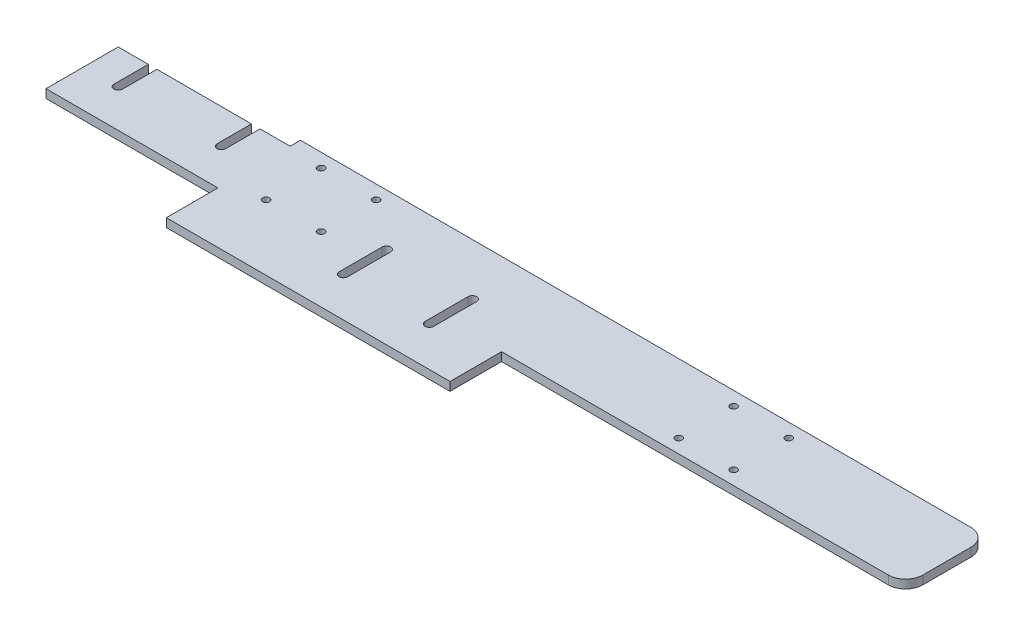
ISO-10303-21;
HEADER;
FILE_DESCRIPTION(('STEP AP214'),'2;1');
FILE_NAME('part.step','',(''),(''),'','','');
FILE_SCHEMA(('AUTOMOTIVE_DESIGN { 1 0 10303 214 1 1 1 1 }'));
ENDSEC;
DATA;
#1=APPLICATION_CONTEXT('core data for automotive mechanical design processes');
#2=APPLICATION_PROTOCOL_DEFINITION('international standard','automotive_design',2000,#1);
#3=PRODUCT_CONTEXT('',#1,'mechanical');
#4=PRODUCT('Part','Part','',(#3));
#5=PRODUCT_RELATED_PRODUCT_CATEGORY('part','',(#4));
#6=PRODUCT_DEFINITION_FORMATION('','',#4);
#7=PRODUCT_DEFINITION_CONTEXT('part definition',#1,'design');
#8=PRODUCT_DEFINITION('design','',#6,#7);
#9=PRODUCT_DEFINITION_SHAPE('','',#8);
#10=(LENGTH_UNIT() NAMED_UNIT(*) SI_UNIT(.MILLI.,.METRE.));
#11=(NAMED_UNIT(*) PLANE_ANGLE_UNIT() SI_UNIT($,.RADIAN.));
#12=(NAMED_UNIT(*) SI_UNIT($,.STERADIAN.) SOLID_ANGLE_UNIT());
#13=UNCERTAINTY_MEASURE_WITH_UNIT(LENGTH_MEASURE(1.E-05),#10,'distance_accuracy_value','');
#14=(GEOMETRIC_REPRESENTATION_CONTEXT(3) GLOBAL_UNCERTAINTY_ASSIGNED_CONTEXT((#13)) GLOBAL_UNIT_ASSIGNED_CONTEXT((#10,
#11,#12)) REPRESENTATION_CONTEXT('',''));
#15=CARTESIAN_POINT('',(0.,0.,0.));
#16=DIRECTION('',(0.,0.,1.));
#17=DIRECTION('',(1.,0.,0.));
#18=AXIS2_PLACEMENT_3D('',#15,#16,#17);
#19=CARTESIAN_POINT('',(-100.,0.,6.00000000000001));
#20=DIRECTION('',(0.,0.,1.));
#21=DIRECTION('',(1.,0.,0.));
#22=AXIS2_PLACEMENT_3D('',#19,#20,#21);
#23=PLANE('',#22);
#24=DIRECTION('',(1.,0.,0.));
#25=VECTOR('',#24,1.);
#26=CARTESIAN_POINT('',(-100.,0.,6.00000000000001));
#27=LINE('',#26,#25);
#28=CARTESIAN_POINT('',(-77.5,0.,6.00000000000001));
#29=VERTEX_POINT('',#28);
#30=CARTESIAN_POINT('',(-22.5,0.,6.));
#31=VERTEX_POINT('',#30);
#32=EDGE_CURVE('E461',#29,#31,#27,.T.);
#33=ORIENTED_EDGE('',*,*,#32,.F.);
#34=DIRECTION('',(0.,1.,0.));
#35=VECTOR('',#34,1.);
#36=CARTESIAN_POINT('',(-77.5,0.,6.00000000000001));
#37=LINE('',#36,#35);
#38=CARTESIAN_POINT('',(-77.5,5.,6.00000000000001));
#39=VERTEX_POINT('',#38);
#40=EDGE_CURVE('E270',#29,#39,#37,.T.);
#41=ORIENTED_EDGE('',*,*,#40,.T.);
#42=DIRECTION('',(1.,0.,0.));
#43=VECTOR('',#42,1.);
#44=CARTESIAN_POINT('',(-100.,5.,6.00000000000001));
#45=LINE('',#44,#43);
#46=CARTESIAN_POINT('',(-22.5,5.,6.00000000000001));
#47=VERTEX_POINT('',#46);
#48=EDGE_CURVE('E467',#39,#47,#45,.T.);
#49=ORIENTED_EDGE('',*,*,#48,.T.);
#50=DIRECTION('',(0.,1.,0.));
#51=VECTOR('',#50,1.);
#52=CARTESIAN_POINT('',(-22.5,0.,6.00000000000001));
#53=LINE('',#52,#51);
#54=EDGE_CURVE('E292',#31,#47,#53,.T.);
#55=ORIENTED_EDGE('',*,*,#54,.F.);
#56=EDGE_LOOP('',(#33,#41,#49,#55));
#57=FACE_BOUND('',#56,.T.);
#58=ADVANCED_FACE('F38',(#57),#23,.F.);
#59=CARTESIAN_POINT('',(-17.5,0.,6.00000000000001));
#60=VERTEX_POINT('',#59);
#61=CARTESIAN_POINT('',(0.,0.,6.));
#62=VERTEX_POINT('',#61);
#63=EDGE_CURVE('E454',#60,#62,#27,.T.);
#64=ORIENTED_EDGE('',*,*,#63,.F.);
#65=DIRECTION('',(0.,1.,0.));
#66=VECTOR('',#65,1.);
#67=CARTESIAN_POINT('',(-17.5,0.,6.00000000000001));
#68=LINE('',#67,#66);
#69=CARTESIAN_POINT('',(-17.5,5.,6.00000000000001));
#70=VERTEX_POINT('',#69);
#71=EDGE_CURVE('E267',#60,#70,#68,.T.);
#72=ORIENTED_EDGE('',*,*,#71,.T.);
#73=CARTESIAN_POINT('',(0.,5.,6.));
#74=VERTEX_POINT('',#73);
#75=EDGE_CURVE('E460',#70,#74,#45,.T.);
#76=ORIENTED_EDGE('',*,*,#75,.T.);
#77=DIRECTION('',(0.,-1.,0.));
#78=VECTOR('',#77,1.);
#79=CARTESIAN_POINT('',(0.,0.,6.));
#80=LINE('',#79,#78);
#81=EDGE_CURVE('E438',#74,#62,#80,.T.);
#82=ORIENTED_EDGE('',*,*,#81,.T.);
#83=EDGE_LOOP('',(#64,#72,#76,#82));
#84=FACE_BOUND('',#83,.T.);
#85=ADVANCED_FACE('F612',(#84),#23,.F.);
#86=CARTESIAN_POINT('',(0.,5.,48.));
#87=DIRECTION('',(0.,0.,-1.));
#88=DIRECTION('',(-1.,0.,0.));
#89=AXIS2_PLACEMENT_3D('',#86,#87,#88);
#90=PLANE('',#89);
#91=DIRECTION('',(0.,-1.,0.));
#92=VECTOR('',#91,1.);
#93=CARTESIAN_POINT('',(0.,0.,48.));
#94=LINE('',#93,#92);
#95=CARTESIAN_POINT('',(0.,5.,48.));
#96=VERTEX_POINT('',#95);
#97=CARTESIAN_POINT('',(0.,0.,48.));
#98=VERTEX_POINT('',#97);
#99=EDGE_CURVE('E407',#96,#98,#94,.T.);
#100=ORIENTED_EDGE('',*,*,#99,.F.);
#101=DIRECTION('',(1.,0.,0.));
#102=VECTOR('',#101,1.);
#103=CARTESIAN_POINT('',(0.,5.,48.));
#104=LINE('',#103,#102);
#105=CARTESIAN_POINT('',(-100.,5.,48.));
#106=VERTEX_POINT('',#105);
#107=EDGE_CURVE('E541',#106,#96,#104,.T.);
#108=ORIENTED_EDGE('',*,*,#107,.F.);
#109=DIRECTION('',(0.,1.,0.));
#110=VECTOR('',#109,1.);
#111=CARTESIAN_POINT('',(-100.,5.,48.));
#112=LINE('',#111,#110);
#113=CARTESIAN_POINT('',(-100.,0.,48.));
#114=VERTEX_POINT('',#113);
#115=EDGE_CURVE('E450',#114,#106,#112,.T.);
#116=ORIENTED_EDGE('',*,*,#115,.F.);
#117=DIRECTION('',(1.,0.,0.));
#118=VECTOR('',#117,1.);
#119=CARTESIAN_POINT('',(0.,0.,48.));
#120=LINE('',#119,#118);
#121=EDGE_CURVE('E556',#114,#98,#120,.T.);
#122=ORIENTED_EDGE('',*,*,#121,.T.);
#123=EDGE_LOOP('',(#100,#108,#116,#122));
#124=FACE_BOUND('',#123,.T.);
#125=ADVANCED_FACE('F632',(#124),#90,.F.);
#126=CARTESIAN_POINT('',(165.,0.,48.));
#127=VERTEX_POINT('',#126);
#128=CARTESIAN_POINT('',(390.,0.,48.));
#129=VERTEX_POINT('',#128);
#130=EDGE_CURVE('E555',#127,#129,#120,.T.);
#131=ORIENTED_EDGE('',*,*,#130,.T.);
#132=DIRECTION('',(0.,-1.,0.));
#133=VECTOR('',#132,1.);
#134=CARTESIAN_POINT('',(390.,5.,48.));
#135=LINE('',#134,#133);
#136=CARTESIAN_POINT('',(390.,5.,48.));
#137=VERTEX_POINT('',#136);
#138=EDGE_CURVE('E62',#129,#137,#135,.F.);
#139=ORIENTED_EDGE('',*,*,#138,.T.);
#140=CARTESIAN_POINT('',(165.,5.,48.));
#141=VERTEX_POINT('',#140);
#142=EDGE_CURVE('E540',#141,#137,#104,.T.);
#143=ORIENTED_EDGE('',*,*,#142,.F.);
#144=DIRECTION('',(0.,1.,0.));
#145=VECTOR('',#144,1.);
#146=CARTESIAN_POINT('',(165.,5.,48.));
#147=LINE('',#146,#145);
#148=EDGE_CURVE('E274',#127,#141,#147,.T.);
#149=ORIENTED_EDGE('',*,*,#148,.F.);
#150=EDGE_LOOP('',(#131,#139,#143,#149));
#151=FACE_BOUND('',#150,.T.);
#152=ADVANCED_FACE('F594',(#151),#90,.F.);
#153=CARTESIAN_POINT('',(0.,5.,0.));
#154=DIRECTION('',(1.,0.,0.));
#155=DIRECTION('',(0.,0.,-1.));
#156=AXIS2_PLACEMENT_3D('',#153,#154,#155);
#157=PLANE('',#156);
#158=ORIENTED_EDGE('',*,*,#81,.F.);
#159=DIRECTION('',(0.,0.,1.));
#160=VECTOR('',#159,1.);
#161=CARTESIAN_POINT('',(0.,5.,0.));
#162=LINE('',#161,#160);
#163=CARTESIAN_POINT('',(0.,5.,0.));
#164=VERTEX_POINT('',#163);
#165=EDGE_CURVE('E535',#164,#74,#162,.T.);
#166=ORIENTED_EDGE('',*,*,#165,.F.);
#167=DIRECTION('',(0.,-1.,0.));
#168=VECTOR('',#167,1.);
#169=CARTESIAN_POINT('',(0.,5.,0.));
#170=LINE('',#169,#168);
#171=CARTESIAN_POINT('',(0.,0.,0.));
#172=VERTEX_POINT('',#171);
#173=EDGE_CURVE('E548',#164,#172,#170,.T.);
#174=ORIENTED_EDGE('',*,*,#173,.T.);
#175=DIRECTION('',(0.,0.,1.));
#176=VECTOR('',#175,1.);
#177=CARTESIAN_POINT('',(0.,0.,0.));
#178=LINE('',#177,#176);
#179=EDGE_CURVE('E551',#172,#62,#178,.T.);
#180=ORIENTED_EDGE('',*,*,#179,.T.);
#181=EDGE_LOOP('',(#158,#166,#174,#180));
#182=FACE_BOUND('',#181,.T.);
#183=ADVANCED_FACE('F609',(#182),#157,.F.);
#184=CARTESIAN_POINT('',(0.,5.,0.));
#185=DIRECTION('',(0.,1.,0.));
#186=DIRECTION('',(0.,0.,1.));
#187=AXIS2_PLACEMENT_3D('',#184,#185,#186);
#188=PLANE('',#187);
#189=ORIENTED_EDGE('',*,*,#142,.T.);
#190=CARTESIAN_POINT('',(390.,5.,38.));
#191=DIRECTION('',(0.,1.,0.));
#192=DIRECTION('',(0.,0.,1.));
#193=AXIS2_PLACEMENT_3D('',#190,#191,#192);
#194=CIRCLE('',#193,10.);
#195=CARTESIAN_POINT('',(400.,5.,38.));
#196=VERTEX_POINT('',#195);
#197=EDGE_CURVE('E47',#137,#196,#194,.T.);
#198=ORIENTED_EDGE('',*,*,#197,.T.);
#199=DIRECTION('',(0.,0.,-1.));
#200=VECTOR('',#199,1.);
#201=CARTESIAN_POINT('',(400.,5.,48.));
#202=LINE('',#201,#200);
#203=CARTESIAN_POINT('',(400.,5.,9.99999999999997));
#204=VERTEX_POINT('',#203);
#205=EDGE_CURVE('E545',#196,#204,#202,.T.);
#206=ORIENTED_EDGE('',*,*,#205,.T.);
#207=CARTESIAN_POINT('',(390.,5.,9.99999999999997));
#208=DIRECTION('',(0.,1.,0.));
#209=DIRECTION('',(0.,0.,1.));
#210=AXIS2_PLACEMENT_3D('',#207,#208,#209);
#211=CIRCLE('',#210,10.);
#212=CARTESIAN_POINT('',(390.,5.,0.));
#213=VERTEX_POINT('',#212);
#214=EDGE_CURVE('E54',#204,#213,#211,.T.);
#215=ORIENTED_EDGE('',*,*,#214,.T.);
#216=DIRECTION('',(-1.,0.,0.));
#217=VECTOR('',#216,1.);
#218=CARTESIAN_POINT('',(400.,5.,0.));
#219=LINE('',#218,#217);
#220=EDGE_CURVE('E532',#213,#164,#219,.T.);
#221=ORIENTED_EDGE('',*,*,#220,.T.);
#222=ORIENTED_EDGE('',*,*,#165,.T.);
#223=ORIENTED_EDGE('',*,*,#75,.F.);
#224=DIRECTION('',(0.,0.,-1.));
#225=VECTOR('',#224,1.);
#226=CARTESIAN_POINT('',(-17.5,5.,6.00000000000001));
#227=LINE('',#226,#225);
#228=CARTESIAN_POINT('',(-17.5,5.,26.));
#229=VERTEX_POINT('',#228);
#230=EDGE_CURVE('E284',#229,#70,#227,.T.);
#231=ORIENTED_EDGE('',*,*,#230,.F.);
#232=CARTESIAN_POINT('',(-20.,5.,26.));
#233=DIRECTION('',(0.,1.,0.));
#234=DIRECTION('',(0.,0.,1.));
#235=AXIS2_PLACEMENT_3D('',#232,#233,#234);
#236=CIRCLE('',#235,2.5);
#237=CARTESIAN_POINT('',(-22.5,5.,26.));
#238=VERTEX_POINT('',#237);
#239=EDGE_CURVE('E297',#238,#229,#236,.T.);
#240=ORIENTED_EDGE('',*,*,#239,.F.);
#241=DIRECTION('',(0.,0.,1.));
#242=VECTOR('',#241,1.);
#243=CARTESIAN_POINT('',(-22.5,5.,6.00000000000001));
#244=LINE('',#243,#242);
#245=EDGE_CURVE('E293',#47,#238,#244,.T.);
#246=ORIENTED_EDGE('',*,*,#245,.F.);
#247=ORIENTED_EDGE('',*,*,#48,.F.);
#248=DIRECTION('',(0.,0.,-1.));
#249=VECTOR('',#248,1.);
#250=CARTESIAN_POINT('',(-77.5,5.,6.00000000000001));
#251=LINE('',#250,#249);
#252=CARTESIAN_POINT('',(-77.5,5.,26.));
#253=VERTEX_POINT('',#252);
#254=EDGE_CURVE('E257',#253,#39,#251,.T.);
#255=ORIENTED_EDGE('',*,*,#254,.F.);
#256=CARTESIAN_POINT('',(-80.,5.,26.));
#257=DIRECTION('',(0.,1.,0.));
#258=DIRECTION('',(0.,0.,1.));
#259=AXIS2_PLACEMENT_3D('',#256,#257,#258);
#260=CIRCLE('',#259,2.5);
#261=CARTESIAN_POINT('',(-82.5,5.,26.));
#262=VERTEX_POINT('',#261);
#263=EDGE_CURVE('E260',#262,#253,#260,.T.);
#264=ORIENTED_EDGE('',*,*,#263,.F.);
#265=DIRECTION('',(0.,0.,1.));
#266=VECTOR('',#265,1.);
#267=CARTESIAN_POINT('',(-82.5,5.,6.00000000000001));
#268=LINE('',#267,#266);
#269=CARTESIAN_POINT('',(-82.5,5.,6.00000000000001));
#270=VERTEX_POINT('',#269);
#271=EDGE_CURVE('E232',#270,#262,#268,.T.);
#272=ORIENTED_EDGE('',*,*,#271,.F.);
#273=CARTESIAN_POINT('',(-100.,5.,6.00000000000001));
#274=VERTEX_POINT('',#273);
#275=EDGE_CURVE('E462',#274,#270,#45,.T.);
#276=ORIENTED_EDGE('',*,*,#275,.F.);
#277=DIRECTION('',(0.,0.,-1.));
#278=VECTOR('',#277,1.);
#279=CARTESIAN_POINT('',(-100.,5.,6.00000000000001));
#280=LINE('',#279,#278);
#281=EDGE_CURVE('E439',#106,#274,#280,.T.);
#282=ORIENTED_EDGE('',*,*,#281,.F.);
#283=ORIENTED_EDGE('',*,*,#107,.T.);
#284=DIRECTION('',(0.,0.,-1.));
#285=VECTOR('',#284,1.);
#286=CARTESIAN_POINT('',(0.,5.,78.));
#287=LINE('',#286,#285);
#288=CARTESIAN_POINT('',(0.,5.,78.));
#289=VERTEX_POINT('',#288);
#290=EDGE_CURVE('E426',#289,#96,#287,.T.);
#291=ORIENTED_EDGE('',*,*,#290,.F.);
#292=DIRECTION('',(-1.,0.,0.));
#293=VECTOR('',#292,1.);
#294=CARTESIAN_POINT('',(0.,5.,78.));
#295=LINE('',#294,#293);
#296=CARTESIAN_POINT('',(165.,5.,78.));
#297=VERTEX_POINT('',#296);
#298=EDGE_CURVE('E410',#297,#289,#295,.T.);
#299=ORIENTED_EDGE('',*,*,#298,.F.);
#300=DIRECTION('',(0.,0.,-1.));
#301=VECTOR('',#300,1.);
#302=CARTESIAN_POINT('',(165.,5.,78.));
#303=LINE('',#302,#301);
#304=EDGE_CURVE('E430',#297,#141,#303,.T.);
#305=ORIENTED_EDGE('',*,*,#304,.T.);
#306=EDGE_LOOP('',(#189,#198,#206,#215,#221,#222,#223,#231,#240,#246,#247,#255,#264,#272,#276,
#282,#283,#291,#299,#305));
#307=FACE_BOUND('',#306,.T.);
#308=CARTESIAN_POINT('',(80.,5.,30.));
#309=DIRECTION('',(0.,1.,0.));
#310=DIRECTION('',(0.,0.,1.));
#311=AXIS2_PLACEMENT_3D('',#308,#309,#310);
#312=CIRCLE('',#311,2.50000000000003);
#313=CARTESIAN_POINT('',(82.5,5.,30.));
#314=VERTEX_POINT('',#313);
#315=CARTESIAN_POINT('',(77.5,5.,30.));
#316=VERTEX_POINT('',#315);
#317=EDGE_CURVE('E333',#314,#316,#312,.T.);
#318=ORIENTED_EDGE('',*,*,#317,.F.);
#319=DIRECTION('',(0.,0.,-1.));
#320=VECTOR('',#319,1.);
#321=CARTESIAN_POINT('',(82.5,5.,30.));
#322=LINE('',#321,#320);
#323=CARTESIAN_POINT('',(82.5,5.,55.));
#324=VERTEX_POINT('',#323);
#325=EDGE_CURVE('E320',#324,#314,#322,.T.);
#326=ORIENTED_EDGE('',*,*,#325,.F.);
#327=CARTESIAN_POINT('',(80.,5.,55.));
#328=DIRECTION('',(0.,1.,0.));
#329=DIRECTION('',(0.,0.,1.));
#330=AXIS2_PLACEMENT_3D('',#327,#328,#329);
#331=CIRCLE('',#330,2.50000000000002);
#332=CARTESIAN_POINT('',(77.5,5.,55.));
#333=VERTEX_POINT('',#332);
#334=EDGE_CURVE('E341',#333,#324,#331,.T.);
#335=ORIENTED_EDGE('',*,*,#334,.F.);
#336=DIRECTION('',(0.,0.,1.));
#337=VECTOR('',#336,1.);
#338=CARTESIAN_POINT('',(77.5,5.,30.));
#339=LINE('',#338,#337);
#340=EDGE_CURVE('E336',#316,#333,#339,.T.);
#341=ORIENTED_EDGE('',*,*,#340,.F.);
#342=EDGE_LOOP('',(#318,#326,#335,#341));
#343=FACE_BOUND('',#342,.T.);
#344=CARTESIAN_POINT('',(130.,5.,30.));
#345=DIRECTION('',(0.,1.,0.));
#346=DIRECTION('',(0.,0.,1.));
#347=AXIS2_PLACEMENT_3D('',#344,#345,#346);
#348=CIRCLE('',#347,2.5);
#349=CARTESIAN_POINT('',(132.5,5.,30.));
#350=VERTEX_POINT('',#349);
#351=CARTESIAN_POINT('',(127.5,5.,30.));
#352=VERTEX_POINT('',#351);
#353=EDGE_CURVE('E377',#350,#352,#348,.T.);
#354=ORIENTED_EDGE('',*,*,#353,.F.);
#355=DIRECTION('',(0.,0.,-1.));
#356=VECTOR('',#355,1.);
#357=CARTESIAN_POINT('',(132.5,5.,30.));
#358=LINE('',#357,#356);
#359=CARTESIAN_POINT('',(132.5,5.,55.));
#360=VERTEX_POINT('',#359);
#361=EDGE_CURVE('E364',#360,#350,#358,.T.);
#362=ORIENTED_EDGE('',*,*,#361,.F.);
#363=CARTESIAN_POINT('',(130.,5.,55.));
#364=DIRECTION('',(0.,1.,0.));
#365=DIRECTION('',(0.,0.,1.));
#366=AXIS2_PLACEMENT_3D('',#363,#364,#365);
#367=CIRCLE('',#366,2.5);
#368=CARTESIAN_POINT('',(127.5,5.,55.));
#369=VERTEX_POINT('',#368);
#370=EDGE_CURVE('E384',#369,#360,#367,.T.);
#371=ORIENTED_EDGE('',*,*,#370,.F.);
#372=DIRECTION('',(0.,0.,1.));
#373=VECTOR('',#372,1.);
#374=CARTESIAN_POINT('',(127.5,5.,30.));
#375=LINE('',#374,#373);
#376=EDGE_CURVE('E380',#352,#369,#375,.T.);
#377=ORIENTED_EDGE('',*,*,#376,.F.);
#378=EDGE_LOOP('',(#354,#362,#371,#377));
#379=FACE_BOUND('',#378,.T.);
#380=CARTESIAN_POINT('',(260.,5.,40.));
#381=DIRECTION('',(0.,1.,0.));
#382=DIRECTION('',(0.,0.,1.));
#383=AXIS2_PLACEMENT_3D('',#380,#381,#382);
#384=CIRCLE('',#383,2.);
#385=CARTESIAN_POINT('',(260.,5.,42.));
#386=VERTEX_POINT('',#385);
#387=EDGE_CURVE('E476',#386,#386,#384,.T.);
#388=ORIENTED_EDGE('',*,*,#387,.F.);
#389=EDGE_LOOP('',(#388));
#390=FACE_BOUND('',#389,.T.);
#391=CARTESIAN_POINT('',(52.,5.,40.));
#392=DIRECTION('',(0.,1.,0.));
#393=DIRECTION('',(0.,0.,1.));
#394=AXIS2_PLACEMENT_3D('',#391,#392,#393);
#395=CIRCLE('',#394,2.00000000000001);
#396=CARTESIAN_POINT('',(52.,5.,42.));
#397=VERTEX_POINT('',#396);
#398=EDGE_CURVE('E492',#397,#397,#395,.T.);
#399=ORIENTED_EDGE('',*,*,#398,.F.);
#400=EDGE_LOOP('',(#399));
#401=FACE_BOUND('',#400,.T.);
#402=CARTESIAN_POINT('',(292.,5.,8.));
#403=DIRECTION('',(0.,1.,0.));
#404=DIRECTION('',(0.,0.,1.));
#405=AXIS2_PLACEMENT_3D('',#402,#403,#404);
#406=CIRCLE('',#405,2.);
#407=CARTESIAN_POINT('',(292.,5.,9.99999999999999));
#408=VERTEX_POINT('',#407);
#409=EDGE_CURVE('E508',#408,#408,#406,.T.);
#410=ORIENTED_EDGE('',*,*,#409,.F.);
#411=EDGE_LOOP('',(#410));
#412=FACE_BOUND('',#411,.T.);
#413=CARTESIAN_POINT('',(20.,5.,8.));
#414=DIRECTION('',(0.,1.,0.));
#415=DIRECTION('',(0.,0.,1.));
#416=AXIS2_PLACEMENT_3D('',#413,#414,#415);
#417=CIRCLE('',#416,2.);
#418=CARTESIAN_POINT('',(20.,5.,10.));
#419=VERTEX_POINT('',#418);
#420=EDGE_CURVE('E524',#419,#419,#417,.T.);
#421=ORIENTED_EDGE('',*,*,#420,.F.);
#422=EDGE_LOOP('',(#421));
#423=FACE_BOUND('',#422,.T.);
#424=CARTESIAN_POINT('',(20.,5.,40.));
#425=DIRECTION('',(0.,1.,0.));
#426=DIRECTION('',(0.,0.,-1.));
#427=AXIS2_PLACEMENT_3D('',#424,#425,#426);
#428=CIRCLE('',#427,2.);
#429=CARTESIAN_POINT('',(20.,5.,38.));
#430=VERTEX_POINT('',#429);
#431=EDGE_CURVE('E516',#430,#430,#428,.T.);
#432=ORIENTED_EDGE('',*,*,#431,.F.);
#433=EDGE_LOOP('',(#432));
#434=FACE_BOUND('',#433,.T.);
#435=CARTESIAN_POINT('',(292.,5.,40.));
#436=DIRECTION('',(0.,1.,0.));
#437=DIRECTION('',(0.,0.,-1.));
#438=AXIS2_PLACEMENT_3D('',#435,#436,#437);
#439=CIRCLE('',#438,2.);
#440=CARTESIAN_POINT('',(292.,5.,38.));
#441=VERTEX_POINT('',#440);
#442=EDGE_CURVE('E500',#441,#441,#439,.T.);
#443=ORIENTED_EDGE('',*,*,#442,.F.);
#444=EDGE_LOOP('',(#443));
#445=FACE_BOUND('',#444,.T.);
#446=CARTESIAN_POINT('',(52.,5.,8.));
#447=DIRECTION('',(0.,1.,0.));
#448=DIRECTION('',(0.,0.,-1.));
#449=AXIS2_PLACEMENT_3D('',#446,#447,#448);
#450=CIRCLE('',#449,2.);
#451=CARTESIAN_POINT('',(52.,5.,6.));
#452=VERTEX_POINT('',#451);
#453=EDGE_CURVE('E484',#452,#452,#450,.T.);
#454=ORIENTED_EDGE('',*,*,#453,.F.);
#455=EDGE_LOOP('',(#454));
#456=FACE_BOUND('',#455,.T.);
#457=CARTESIAN_POINT('',(260.,5.,8.));
#458=DIRECTION('',(0.,1.,0.));
#459=DIRECTION('',(0.,0.,-1.));
#460=AXIS2_PLACEMENT_3D('',#457,#458,#459);
#461=CIRCLE('',#460,2.);
#462=CARTESIAN_POINT('',(260.,5.,6.));
#463=VERTEX_POINT('',#462);
#464=EDGE_CURVE('E468',#463,#463,#461,.T.);
#465=ORIENTED_EDGE('',*,*,#464,.F.);
#466=EDGE_LOOP('',(#465));
#467=FACE_BOUND('',#466,.T.);
#468=ADVANCED_FACE('F584',(#307,#343,#379,#390,#401,#412,#423,#434,#445,#456,#467),#188,.T.);
#469=CARTESIAN_POINT('',(0.,0.,0.));
#470=DIRECTION('',(0.,1.,0.));
#471=DIRECTION('',(0.,0.,1.));
#472=AXIS2_PLACEMENT_3D('',#469,#470,#471);
#473=PLANE('',#472);
#474=DIRECTION('',(0.,0.,-1.));
#475=VECTOR('',#474,1.);
#476=CARTESIAN_POINT('',(82.5,0.,30.));
#477=LINE('',#476,#475);
#478=CARTESIAN_POINT('',(82.5,0.,55.));
#479=VERTEX_POINT('',#478);
#480=CARTESIAN_POINT('',(82.5,0.,30.));
#481=VERTEX_POINT('',#480);
#482=EDGE_CURVE('E328',#479,#481,#477,.T.);
#483=ORIENTED_EDGE('',*,*,#482,.T.);
#484=CARTESIAN_POINT('',(80.,0.,30.));
#485=DIRECTION('',(0.,1.,0.));
#486=DIRECTION('',(0.,0.,1.));
#487=AXIS2_PLACEMENT_3D('',#484,#485,#486);
#488=CIRCLE('',#487,2.50000000000003);
#489=CARTESIAN_POINT('',(77.5,0.,30.));
#490=VERTEX_POINT('',#489);
#491=EDGE_CURVE('E315',#481,#490,#488,.T.);
#492=ORIENTED_EDGE('',*,*,#491,.T.);
#493=DIRECTION('',(0.,0.,1.));
#494=VECTOR('',#493,1.);
#495=CARTESIAN_POINT('',(77.5,0.,30.));
#496=LINE('',#495,#494);
#497=CARTESIAN_POINT('',(77.5,0.,55.));
#498=VERTEX_POINT('',#497);
#499=EDGE_CURVE('E319',#490,#498,#496,.T.);
#500=ORIENTED_EDGE('',*,*,#499,.T.);
#501=CARTESIAN_POINT('',(80.,0.,55.));
#502=DIRECTION('',(0.,1.,0.));
#503=DIRECTION('',(0.,0.,1.));
#504=AXIS2_PLACEMENT_3D('',#501,#502,#503);
#505=CIRCLE('',#504,2.50000000000002);
#506=EDGE_CURVE('E324',#498,#479,#505,.T.);
#507=ORIENTED_EDGE('',*,*,#506,.T.);
#508=EDGE_LOOP('',(#483,#492,#500,#507));
#509=FACE_BOUND('',#508,.T.);
#510=DIRECTION('',(0.,0.,-1.));
#511=VECTOR('',#510,1.);
#512=CARTESIAN_POINT('',(132.5,0.,30.));
#513=LINE('',#512,#511);
#514=CARTESIAN_POINT('',(132.5,0.,55.));
#515=VERTEX_POINT('',#514);
#516=CARTESIAN_POINT('',(132.5,0.,30.));
#517=VERTEX_POINT('',#516);
#518=EDGE_CURVE('E372',#515,#517,#513,.T.);
#519=ORIENTED_EDGE('',*,*,#518,.T.);
#520=CARTESIAN_POINT('',(130.,0.,30.));
#521=DIRECTION('',(0.,1.,0.));
#522=DIRECTION('',(0.,0.,1.));
#523=AXIS2_PLACEMENT_3D('',#520,#521,#522);
#524=CIRCLE('',#523,2.5);
#525=CARTESIAN_POINT('',(127.5,0.,30.));
#526=VERTEX_POINT('',#525);
#527=EDGE_CURVE('E359',#517,#526,#524,.T.);
#528=ORIENTED_EDGE('',*,*,#527,.T.);
#529=DIRECTION('',(0.,0.,1.));
#530=VECTOR('',#529,1.);
#531=CARTESIAN_POINT('',(127.5,0.,30.));
#532=LINE('',#531,#530);
#533=CARTESIAN_POINT('',(127.5,0.,55.));
#534=VERTEX_POINT('',#533);
#535=EDGE_CURVE('E363',#526,#534,#532,.T.);
#536=ORIENTED_EDGE('',*,*,#535,.T.);
#537=CARTESIAN_POINT('',(130.,0.,55.));
#538=DIRECTION('',(0.,1.,0.));
#539=DIRECTION('',(0.,0.,1.));
#540=AXIS2_PLACEMENT_3D('',#537,#538,#539);
#541=CIRCLE('',#540,2.5);
#542=EDGE_CURVE('E368',#534,#515,#541,.T.);
#543=ORIENTED_EDGE('',*,*,#542,.T.);
#544=EDGE_LOOP('',(#519,#528,#536,#543));
#545=FACE_BOUND('',#544,.T.);
#546=DIRECTION('',(0.,0.,-1.));
#547=VECTOR('',#546,1.);
#548=CARTESIAN_POINT('',(400.,0.,48.));
#549=LINE('',#548,#547);
#550=CARTESIAN_POINT('',(400.,0.,38.));
#551=VERTEX_POINT('',#550);
#552=CARTESIAN_POINT('',(400.,0.,9.99999999999997));
#553=VERTEX_POINT('',#552);
#554=EDGE_CURVE('E536',#551,#553,#549,.T.);
#555=ORIENTED_EDGE('',*,*,#554,.F.);
#556=CARTESIAN_POINT('',(390.,0.,38.));
#557=DIRECTION('',(0.,1.,0.));
#558=DIRECTION('',(0.,0.,1.));
#559=AXIS2_PLACEMENT_3D('',#556,#557,#558);
#560=CIRCLE('',#559,10.);
#561=EDGE_CURVE('E575',#551,#129,#560,.F.);
#562=ORIENTED_EDGE('',*,*,#561,.T.);
#563=ORIENTED_EDGE('',*,*,#130,.F.);
#564=DIRECTION('',(0.,0.,-1.));
#565=VECTOR('',#564,1.);
#566=CARTESIAN_POINT('',(165.,0.,78.));
#567=LINE('',#566,#565);
#568=CARTESIAN_POINT('',(165.,0.,78.));
#569=VERTEX_POINT('',#568);
#570=EDGE_CURVE('E434',#569,#127,#567,.T.);
#571=ORIENTED_EDGE('',*,*,#570,.F.);
#572=DIRECTION('',(1.,0.,0.));
#573=VECTOR('',#572,1.);
#574=CARTESIAN_POINT('',(165.,0.,78.));
#575=LINE('',#574,#573);
#576=CARTESIAN_POINT('',(0.,0.,78.));
#577=VERTEX_POINT('',#576);
#578=EDGE_CURVE('E402',#577,#569,#575,.T.);
#579=ORIENTED_EDGE('',*,*,#578,.F.);
#580=DIRECTION('',(0.,0.,-1.));
#581=VECTOR('',#580,1.);
#582=CARTESIAN_POINT('',(0.,0.,78.));
#583=LINE('',#582,#581);
#584=EDGE_CURVE('E416',#577,#98,#583,.T.);
#585=ORIENTED_EDGE('',*,*,#584,.T.);
#586=ORIENTED_EDGE('',*,*,#121,.F.);
#587=DIRECTION('',(0.,0.,1.));
#588=VECTOR('',#587,1.);
#589=CARTESIAN_POINT('',(-100.,0.,48.));
#590=LINE('',#589,#588);
#591=CARTESIAN_POINT('',(-100.,0.,6.00000000000001));
#592=VERTEX_POINT('',#591);
#593=EDGE_CURVE('E446',#592,#114,#590,.T.);
#594=ORIENTED_EDGE('',*,*,#593,.F.);
#595=CARTESIAN_POINT('',(-82.5,0.,6.00000000000001));
#596=VERTEX_POINT('',#595);
#597=EDGE_CURVE('E255',#592,#596,#27,.T.);
#598=ORIENTED_EDGE('',*,*,#597,.T.);
#599=DIRECTION('',(0.,0.,1.));
#600=VECTOR('',#599,1.);
#601=CARTESIAN_POINT('',(-82.5,0.,6.00000000000001));
#602=LINE('',#601,#600);
#603=CARTESIAN_POINT('',(-82.5,0.,26.));
#604=VERTEX_POINT('',#603);
#605=EDGE_CURVE('E229',#596,#604,#602,.T.);
#606=ORIENTED_EDGE('',*,*,#605,.T.);
#607=CARTESIAN_POINT('',(-80.,0.,26.));
#608=DIRECTION('',(0.,1.,0.));
#609=DIRECTION('',(0.,0.,1.));
#610=AXIS2_PLACEMENT_3D('',#607,#608,#609);
#611=CIRCLE('',#610,2.5);
#612=CARTESIAN_POINT('',(-77.5,0.,26.));
#613=VERTEX_POINT('',#612);
#614=EDGE_CURVE('E241',#604,#613,#611,.T.);
#615=ORIENTED_EDGE('',*,*,#614,.T.);
#616=DIRECTION('',(0.,0.,-1.));
#617=VECTOR('',#616,1.);
#618=CARTESIAN_POINT('',(-77.5,0.,6.00000000000001));
#619=LINE('',#618,#617);
#620=EDGE_CURVE('E247',#613,#29,#619,.T.);
#621=ORIENTED_EDGE('',*,*,#620,.T.);
#622=ORIENTED_EDGE('',*,*,#32,.T.);
#623=DIRECTION('',(0.,0.,1.));
#624=VECTOR('',#623,1.);
#625=CARTESIAN_POINT('',(-22.5,0.,6.00000000000001));
#626=LINE('',#625,#624);
#627=CARTESIAN_POINT('',(-22.5,0.,26.));
#628=VERTEX_POINT('',#627);
#629=EDGE_CURVE('E279',#31,#628,#626,.T.);
#630=ORIENTED_EDGE('',*,*,#629,.T.);
#631=CARTESIAN_POINT('',(-20.,0.,26.));
#632=DIRECTION('',(0.,1.,0.));
#633=DIRECTION('',(0.,0.,1.));
#634=AXIS2_PLACEMENT_3D('',#631,#632,#633);
#635=CIRCLE('',#634,2.5);
#636=CARTESIAN_POINT('',(-17.5,0.,26.));
#637=VERTEX_POINT('',#636);
#638=EDGE_CURVE('E283',#628,#637,#635,.T.);
#639=ORIENTED_EDGE('',*,*,#638,.T.);
#640=DIRECTION('',(0.,0.,-1.));
#641=VECTOR('',#640,1.);
#642=CARTESIAN_POINT('',(-17.5,0.,6.00000000000001));
#643=LINE('',#642,#641);
#644=EDGE_CURVE('E288',#637,#60,#643,.T.);
#645=ORIENTED_EDGE('',*,*,#644,.T.);
#646=ORIENTED_EDGE('',*,*,#63,.T.);
#647=ORIENTED_EDGE('',*,*,#179,.F.);
#648=DIRECTION('',(-1.,0.,0.));
#649=VECTOR('',#648,1.);
#650=CARTESIAN_POINT('',(400.,0.,0.));
#651=LINE('',#650,#649);
#652=CARTESIAN_POINT('',(390.,0.,0.));
#653=VERTEX_POINT('',#652);
#654=EDGE_CURVE('E528',#653,#172,#651,.T.);
#655=ORIENTED_EDGE('',*,*,#654,.F.);
#656=CARTESIAN_POINT('',(390.,0.,9.99999999999997));
#657=DIRECTION('',(0.,1.,0.));
#658=DIRECTION('',(0.,0.,1.));
#659=AXIS2_PLACEMENT_3D('',#656,#657,#658);
#660=CIRCLE('',#659,10.);
#661=EDGE_CURVE('E572',#653,#553,#660,.F.);
#662=ORIENTED_EDGE('',*,*,#661,.T.);
#663=EDGE_LOOP('',(#555,#562,#563,#571,#579,#585,#586,#594,#598,#606,#615,#621,#622,#630,#639,
#645,#646,#647,#655,#662));
#664=FACE_BOUND('',#663,.T.);
#665=CARTESIAN_POINT('',(20.,0.,8.));
#666=DIRECTION('',(0.,1.,0.));
#667=DIRECTION('',(0.,0.,1.));
#668=AXIS2_PLACEMENT_3D('',#665,#666,#667);
#669=CIRCLE('',#668,2.);
#670=CARTESIAN_POINT('',(20.,0.,10.));
#671=VERTEX_POINT('',#670);
#672=EDGE_CURVE('E520',#671,#671,#669,.T.);
#673=ORIENTED_EDGE('',*,*,#672,.T.);
#674=EDGE_LOOP('',(#673));
#675=FACE_BOUND('',#674,.T.);
#676=CARTESIAN_POINT('',(20.,0.,40.));
#677=DIRECTION('',(0.,1.,0.));
#678=DIRECTION('',(0.,0.,-1.));
#679=AXIS2_PLACEMENT_3D('',#676,#677,#678);
#680=CIRCLE('',#679,2.);
#681=CARTESIAN_POINT('',(20.,0.,38.));
#682=VERTEX_POINT('',#681);
#683=EDGE_CURVE('E512',#682,#682,#680,.T.);
#684=ORIENTED_EDGE('',*,*,#683,.T.);
#685=EDGE_LOOP('',(#684));
#686=FACE_BOUND('',#685,.T.);
#687=CARTESIAN_POINT('',(292.,0.,8.));
#688=DIRECTION('',(0.,1.,0.));
#689=DIRECTION('',(0.,0.,1.));
#690=AXIS2_PLACEMENT_3D('',#687,#688,#689);
#691=CIRCLE('',#690,2.);
#692=CARTESIAN_POINT('',(292.,0.,9.99999999999999));
#693=VERTEX_POINT('',#692);
#694=EDGE_CURVE('E504',#693,#693,#691,.T.);
#695=ORIENTED_EDGE('',*,*,#694,.T.);
#696=EDGE_LOOP('',(#695));
#697=FACE_BOUND('',#696,.T.);
#698=CARTESIAN_POINT('',(292.,0.,40.));
#699=DIRECTION('',(0.,1.,0.));
#700=DIRECTION('',(0.,0.,-1.));
#701=AXIS2_PLACEMENT_3D('',#698,#699,#700);
#702=CIRCLE('',#701,2.);
#703=CARTESIAN_POINT('',(292.,0.,38.));
#704=VERTEX_POINT('',#703);
#705=EDGE_CURVE('E496',#704,#704,#702,.T.);
#706=ORIENTED_EDGE('',*,*,#705,.T.);
#707=EDGE_LOOP('',(#706));
#708=FACE_BOUND('',#707,.T.);
#709=CARTESIAN_POINT('',(52.,0.,40.));
#710=DIRECTION('',(0.,1.,0.));
#711=DIRECTION('',(0.,0.,1.));
#712=AXIS2_PLACEMENT_3D('',#709,#710,#711);
#713=CIRCLE('',#712,2.00000000000001);
#714=CARTESIAN_POINT('',(52.,0.,42.));
#715=VERTEX_POINT('',#714);
#716=EDGE_CURVE('E488',#715,#715,#713,.T.);
#717=ORIENTED_EDGE('',*,*,#716,.T.);
#718=EDGE_LOOP('',(#717));
#719=FACE_BOUND('',#718,.T.);
#720=CARTESIAN_POINT('',(52.,0.,8.));
#721=DIRECTION('',(0.,1.,0.));
#722=DIRECTION('',(0.,0.,-1.));
#723=AXIS2_PLACEMENT_3D('',#720,#721,#722);
#724=CIRCLE('',#723,2.);
#725=CARTESIAN_POINT('',(52.,0.,6.));
#726=VERTEX_POINT('',#725);
#727=EDGE_CURVE('E480',#726,#726,#724,.T.);
#728=ORIENTED_EDGE('',*,*,#727,.T.);
#729=EDGE_LOOP('',(#728));
#730=FACE_BOUND('',#729,.T.);
#731=CARTESIAN_POINT('',(260.,0.,40.));
#732=DIRECTION('',(0.,1.,0.));
#733=DIRECTION('',(0.,0.,1.));
#734=AXIS2_PLACEMENT_3D('',#731,#732,#733);
#735=CIRCLE('',#734,2.);
#736=CARTESIAN_POINT('',(260.,0.,42.));
#737=VERTEX_POINT('',#736);
#738=EDGE_CURVE('E472',#737,#737,#735,.T.);
#739=ORIENTED_EDGE('',*,*,#738,.T.);
#740=EDGE_LOOP('',(#739));
#741=FACE_BOUND('',#740,.T.);
#742=CARTESIAN_POINT('',(260.,0.,8.));
#743=DIRECTION('',(0.,1.,0.));
#744=DIRECTION('',(0.,0.,-1.));
#745=AXIS2_PLACEMENT_3D('',#742,#743,#744);
#746=CIRCLE('',#745,2.);
#747=CARTESIAN_POINT('',(260.,0.,6.));
#748=VERTEX_POINT('',#747);
#749=EDGE_CURVE('E466',#748,#748,#746,.T.);
#750=ORIENTED_EDGE('',*,*,#749,.T.);
#751=EDGE_LOOP('',(#750));
#752=FACE_BOUND('',#751,.T.);
#753=ADVANCED_FACE('F251',(#509,#545,#664,#675,#686,#697,#708,#719,#730,#741,#752),#473,.F.);
#754=CARTESIAN_POINT('',(400.,5.,0.));
#755=DIRECTION('',(0.,0.,1.));
#756=DIRECTION('',(1.,0.,0.));
#757=AXIS2_PLACEMENT_3D('',#754,#755,#756);
#758=PLANE('',#757);
#759=ORIENTED_EDGE('',*,*,#220,.F.);
#760=DIRECTION('',(0.,-1.,0.));
#761=VECTOR('',#760,1.);
#762=CARTESIAN_POINT('',(390.,5.,0.));
#763=LINE('',#762,#761);
#764=EDGE_CURVE('E11',#213,#653,#763,.T.);
#765=ORIENTED_EDGE('',*,*,#764,.T.);
#766=ORIENTED_EDGE('',*,*,#654,.T.);
#767=ORIENTED_EDGE('',*,*,#173,.F.);
#768=EDGE_LOOP('',(#759,#765,#766,#767));
#769=FACE_BOUND('',#768,.T.);
#770=ADVANCED_FACE('F617',(#769),#758,.F.);
#771=CARTESIAN_POINT('',(400.,5.,48.));
#772=DIRECTION('',(-1.,0.,0.));
#773=DIRECTION('',(0.,0.,1.));
#774=AXIS2_PLACEMENT_3D('',#771,#772,#773);
#775=PLANE('',#774);
#776=ORIENTED_EDGE('',*,*,#205,.F.);
#777=DIRECTION('',(0.,-1.,0.));
#778=VECTOR('',#777,1.);
#779=CARTESIAN_POINT('',(400.,5.,38.));
#780=LINE('',#779,#778);
#781=EDGE_CURVE('E568',#196,#551,#780,.T.);
#782=ORIENTED_EDGE('',*,*,#781,.T.);
#783=ORIENTED_EDGE('',*,*,#554,.T.);
#784=DIRECTION('',(0.,-1.,0.));
#785=VECTOR('',#784,1.);
#786=CARTESIAN_POINT('',(400.,5.,9.99999999999997));
#787=LINE('',#786,#785);
#788=EDGE_CURVE('E565',#553,#204,#787,.F.);
#789=ORIENTED_EDGE('',*,*,#788,.T.);
#790=EDGE_LOOP('',(#776,#782,#783,#789));
#791=FACE_BOUND('',#790,.T.);
#792=ADVANCED_FACE('F589',(#791),#775,.F.);
#793=CARTESIAN_POINT('',(20.,5.,8.));
#794=DIRECTION('',(0.,-1.,0.));
#795=DIRECTION('',(0.,0.,-1.));
#796=AXIS2_PLACEMENT_3D('',#793,#794,#795);
#797=CYLINDRICAL_SURFACE('',#796,2.);
#798=ORIENTED_EDGE('',*,*,#420,.T.);
#799=EDGE_LOOP('',(#798));
#800=FACE_BOUND('',#799,.T.);
#801=ORIENTED_EDGE('',*,*,#672,.F.);
#802=EDGE_LOOP('',(#801));
#803=FACE_BOUND('',#802,.T.);
#804=ADVANCED_FACE('F741',(#800,#803),#797,.F.);
#805=CARTESIAN_POINT('',(20.,5.,40.));
#806=DIRECTION('',(0.,-1.,0.));
#807=DIRECTION('',(0.,0.,-1.));
#808=AXIS2_PLACEMENT_3D('',#805,#806,#807);
#809=CYLINDRICAL_SURFACE('',#808,2.);
#810=ORIENTED_EDGE('',*,*,#431,.T.);
#811=EDGE_LOOP('',(#810));
#812=FACE_BOUND('',#811,.T.);
#813=ORIENTED_EDGE('',*,*,#683,.F.);
#814=EDGE_LOOP('',(#813));
#815=FACE_BOUND('',#814,.T.);
#816=ADVANCED_FACE('F751',(#812,#815),#809,.F.);
#817=CARTESIAN_POINT('',(292.,5.,8.));
#818=DIRECTION('',(0.,-1.,0.));
#819=DIRECTION('',(0.,0.,-1.));
#820=AXIS2_PLACEMENT_3D('',#817,#818,#819);
#821=CYLINDRICAL_SURFACE('',#820,2.);
#822=ORIENTED_EDGE('',*,*,#409,.T.);
#823=EDGE_LOOP('',(#822));
#824=FACE_BOUND('',#823,.T.);
#825=ORIENTED_EDGE('',*,*,#694,.F.);
#826=EDGE_LOOP('',(#825));
#827=FACE_BOUND('',#826,.T.);
#828=ADVANCED_FACE('F755',(#824,#827),#821,.F.);
#829=CARTESIAN_POINT('',(292.,5.,40.));
#830=DIRECTION('',(0.,-1.,0.));
#831=DIRECTION('',(0.,0.,-1.));
#832=AXIS2_PLACEMENT_3D('',#829,#830,#831);
#833=CYLINDRICAL_SURFACE('',#832,2.);
#834=ORIENTED_EDGE('',*,*,#442,.T.);
#835=EDGE_LOOP('',(#834));
#836=FACE_BOUND('',#835,.T.);
#837=ORIENTED_EDGE('',*,*,#705,.F.);
#838=EDGE_LOOP('',(#837));
#839=FACE_BOUND('',#838,.T.);
#840=ADVANCED_FACE('F759',(#836,#839),#833,.F.);
#841=CARTESIAN_POINT('',(52.,5.,40.));
#842=DIRECTION('',(0.,-1.,0.));
#843=DIRECTION('',(0.,0.,-1.));
#844=AXIS2_PLACEMENT_3D('',#841,#842,#843);
#845=CYLINDRICAL_SURFACE('',#844,2.00000000000001);
#846=ORIENTED_EDGE('',*,*,#398,.T.);
#847=EDGE_LOOP('',(#846));
#848=FACE_BOUND('',#847,.T.);
#849=ORIENTED_EDGE('',*,*,#716,.F.);
#850=EDGE_LOOP('',(#849));
#851=FACE_BOUND('',#850,.T.);
#852=ADVANCED_FACE('F763',(#848,#851),#845,.F.);
#853=CARTESIAN_POINT('',(52.,5.,8.));
#854=DIRECTION('',(0.,-1.,0.));
#855=DIRECTION('',(0.,0.,-1.));
#856=AXIS2_PLACEMENT_3D('',#853,#854,#855);
#857=CYLINDRICAL_SURFACE('',#856,2.);
#858=ORIENTED_EDGE('',*,*,#453,.T.);
#859=EDGE_LOOP('',(#858));
#860=FACE_BOUND('',#859,.T.);
#861=ORIENTED_EDGE('',*,*,#727,.F.);
#862=EDGE_LOOP('',(#861));
#863=FACE_BOUND('',#862,.T.);
#864=ADVANCED_FACE('F767',(#860,#863),#857,.F.);
#865=CARTESIAN_POINT('',(260.,5.,40.));
#866=DIRECTION('',(0.,-1.,0.));
#867=DIRECTION('',(0.,0.,-1.));
#868=AXIS2_PLACEMENT_3D('',#865,#866,#867);
#869=CYLINDRICAL_SURFACE('',#868,2.);
#870=ORIENTED_EDGE('',*,*,#387,.T.);
#871=EDGE_LOOP('',(#870));
#872=FACE_BOUND('',#871,.T.);
#873=ORIENTED_EDGE('',*,*,#738,.F.);
#874=EDGE_LOOP('',(#873));
#875=FACE_BOUND('',#874,.T.);
#876=ADVANCED_FACE('F646',(#872,#875),#869,.F.);
#877=CARTESIAN_POINT('',(260.,5.,8.));
#878=DIRECTION('',(0.,-1.,0.));
#879=DIRECTION('',(0.,0.,-1.));
#880=AXIS2_PLACEMENT_3D('',#877,#878,#879);
#881=CYLINDRICAL_SURFACE('',#880,2.);
#882=ORIENTED_EDGE('',*,*,#464,.T.);
#883=EDGE_LOOP('',(#882));
#884=FACE_BOUND('',#883,.T.);
#885=ORIENTED_EDGE('',*,*,#749,.F.);
#886=EDGE_LOOP('',(#885));
#887=FACE_BOUND('',#886,.T.);
#888=ADVANCED_FACE('F638',(#884,#887),#881,.F.);
#889=ORIENTED_EDGE('',*,*,#275,.T.);
#890=DIRECTION('',(0.,1.,0.));
#891=VECTOR('',#890,1.);
#892=CARTESIAN_POINT('',(-82.5,0.,6.00000000000001));
#893=LINE('',#892,#891);
#894=EDGE_CURVE('E238',#596,#270,#893,.T.);
#895=ORIENTED_EDGE('',*,*,#894,.F.);
#896=ORIENTED_EDGE('',*,*,#597,.F.);
#897=DIRECTION('',(0.,-1.,0.));
#898=VECTOR('',#897,1.);
#899=CARTESIAN_POINT('',(-100.,0.,6.00000000000001));
#900=LINE('',#899,#898);
#901=EDGE_CURVE('E443',#274,#592,#900,.T.);
#902=ORIENTED_EDGE('',*,*,#901,.F.);
#903=EDGE_LOOP('',(#889,#895,#896,#902));
#904=FACE_BOUND('',#903,.T.);
#905=ADVANCED_FACE('F628',(#904),#23,.F.);
#906=CARTESIAN_POINT('',(-100.,0.,0.));
#907=DIRECTION('',(1.,0.,0.));
#908=DIRECTION('',(0.,0.,-1.));
#909=AXIS2_PLACEMENT_3D('',#906,#907,#908);
#910=PLANE('',#909);
#911=ORIENTED_EDGE('',*,*,#281,.T.);
#912=ORIENTED_EDGE('',*,*,#901,.T.);
#913=ORIENTED_EDGE('',*,*,#593,.T.);
#914=ORIENTED_EDGE('',*,*,#115,.T.);
#915=EDGE_LOOP('',(#911,#912,#913,#914));
#916=FACE_BOUND('',#915,.T.);
#917=ADVANCED_FACE('F637',(#916),#910,.F.);
#918=CARTESIAN_POINT('',(165.,5.,78.));
#919=DIRECTION('',(-1.,0.,0.));
#920=DIRECTION('',(0.,0.,1.));
#921=AXIS2_PLACEMENT_3D('',#918,#919,#920);
#922=PLANE('',#921);
#923=ORIENTED_EDGE('',*,*,#148,.T.);
#924=ORIENTED_EDGE('',*,*,#304,.F.);
#925=DIRECTION('',(0.,1.,0.));
#926=VECTOR('',#925,1.);
#927=CARTESIAN_POINT('',(165.,5.,78.));
#928=LINE('',#927,#926);
#929=EDGE_CURVE('E406',#569,#297,#928,.T.);
#930=ORIENTED_EDGE('',*,*,#929,.F.);
#931=ORIENTED_EDGE('',*,*,#570,.T.);
#932=EDGE_LOOP('',(#923,#924,#930,#931));
#933=FACE_BOUND('',#932,.T.);
#934=ADVANCED_FACE('F644',(#933),#922,.F.);
#935=CARTESIAN_POINT('',(0.,0.,78.));
#936=DIRECTION('',(1.,0.,0.));
#937=DIRECTION('',(0.,0.,-1.));
#938=AXIS2_PLACEMENT_3D('',#935,#936,#937);
#939=PLANE('',#938);
#940=ORIENTED_EDGE('',*,*,#99,.T.);
#941=ORIENTED_EDGE('',*,*,#584,.F.);
#942=DIRECTION('',(0.,-1.,0.));
#943=VECTOR('',#942,1.);
#944=CARTESIAN_POINT('',(0.,0.,78.));
#945=LINE('',#944,#943);
#946=EDGE_CURVE('E413',#289,#577,#945,.T.);
#947=ORIENTED_EDGE('',*,*,#946,.F.);
#948=ORIENTED_EDGE('',*,*,#290,.T.);
#949=EDGE_LOOP('',(#940,#941,#947,#948));
#950=FACE_BOUND('',#949,.T.);
#951=ADVANCED_FACE('F671',(#950),#939,.F.);
#952=CARTESIAN_POINT('',(0.,0.,78.));
#953=DIRECTION('',(0.,0.,-1.));
#954=DIRECTION('',(-1.,0.,0.));
#955=AXIS2_PLACEMENT_3D('',#952,#953,#954);
#956=PLANE('',#955);
#957=ORIENTED_EDGE('',*,*,#578,.T.);
#958=ORIENTED_EDGE('',*,*,#929,.T.);
#959=ORIENTED_EDGE('',*,*,#298,.T.);
#960=ORIENTED_EDGE('',*,*,#946,.T.);
#961=EDGE_LOOP('',(#957,#958,#959,#960));
#962=FACE_BOUND('',#961,.T.);
#963=ADVANCED_FACE('F664',(#962),#956,.F.);
#964=CARTESIAN_POINT('',(-17.5,0.,6.00000000000001));
#965=DIRECTION('',(1.,0.,0.));
#966=DIRECTION('',(0.,0.,-1.));
#967=AXIS2_PLACEMENT_3D('',#964,#965,#966);
#968=PLANE('',#967);
#969=ORIENTED_EDGE('',*,*,#230,.T.);
#970=ORIENTED_EDGE('',*,*,#71,.F.);
#971=ORIENTED_EDGE('',*,*,#644,.F.);
#972=DIRECTION('',(0.,1.,0.));
#973=VECTOR('',#972,1.);
#974=CARTESIAN_POINT('',(-17.5,0.,26.));
#975=LINE('',#974,#973);
#976=EDGE_CURVE('E307',#637,#229,#975,.T.);
#977=ORIENTED_EDGE('',*,*,#976,.T.);
#978=EDGE_LOOP('',(#969,#970,#971,#977));
#979=FACE_BOUND('',#978,.T.);
#980=ADVANCED_FACE('F662',(#979),#968,.F.);
#981=CARTESIAN_POINT('',(-20.,0.,26.));
#982=DIRECTION('',(0.,1.,0.));
#983=DIRECTION('',(0.,0.,1.));
#984=AXIS2_PLACEMENT_3D('',#981,#982,#983);
#985=CYLINDRICAL_SURFACE('',#984,2.5);
#986=ORIENTED_EDGE('',*,*,#239,.T.);
#987=ORIENTED_EDGE('',*,*,#976,.F.);
#988=ORIENTED_EDGE('',*,*,#638,.F.);
#989=DIRECTION('',(0.,1.,0.));
#990=VECTOR('',#989,1.);
#991=CARTESIAN_POINT('',(-22.5,0.,26.));
#992=LINE('',#991,#990);
#993=EDGE_CURVE('E310',#628,#238,#992,.T.);
#994=ORIENTED_EDGE('',*,*,#993,.T.);
#995=EDGE_LOOP('',(#986,#987,#988,#994));
#996=FACE_BOUND('',#995,.T.);
#997=ADVANCED_FACE('F660',(#996),#985,.F.);
#998=CARTESIAN_POINT('',(-22.5,0.,6.00000000000001));
#999=DIRECTION('',(-1.,0.,0.));
#1000=DIRECTION('',(0.,0.,1.));
#1001=AXIS2_PLACEMENT_3D('',#998,#999,#1000);
#1002=PLANE('',#1001);
#1003=ORIENTED_EDGE('',*,*,#245,.T.);
#1004=ORIENTED_EDGE('',*,*,#993,.F.);
#1005=ORIENTED_EDGE('',*,*,#629,.F.);
#1006=ORIENTED_EDGE('',*,*,#54,.T.);
#1007=EDGE_LOOP('',(#1003,#1004,#1005,#1006));
#1008=FACE_BOUND('',#1007,.T.);
#1009=ADVANCED_FACE('F658',(#1008),#1002,.F.);
#1010=CARTESIAN_POINT('',(-77.5,0.,6.00000000000001));
#1011=DIRECTION('',(1.,0.,0.));
#1012=DIRECTION('',(0.,0.,-1.));
#1013=AXIS2_PLACEMENT_3D('',#1010,#1011,#1012);
#1014=PLANE('',#1013);
#1015=ORIENTED_EDGE('',*,*,#254,.T.);
#1016=ORIENTED_EDGE('',*,*,#40,.F.);
#1017=ORIENTED_EDGE('',*,*,#620,.F.);
#1018=DIRECTION('',(0.,1.,0.));
#1019=VECTOR('',#1018,1.);
#1020=CARTESIAN_POINT('',(-77.5,0.,26.));
#1021=LINE('',#1020,#1019);
#1022=EDGE_CURVE('E237',#613,#253,#1021,.T.);
#1023=ORIENTED_EDGE('',*,*,#1022,.T.);
#1024=EDGE_LOOP('',(#1015,#1016,#1017,#1023));
#1025=FACE_BOUND('',#1024,.T.);
#1026=ADVANCED_FACE('F654',(#1025),#1014,.F.);
#1027=CARTESIAN_POINT('',(-80.,0.,26.));
#1028=DIRECTION('',(0.,1.,0.));
#1029=DIRECTION('',(0.,0.,1.));
#1030=AXIS2_PLACEMENT_3D('',#1027,#1028,#1029);
#1031=CYLINDRICAL_SURFACE('',#1030,2.5);
#1032=ORIENTED_EDGE('',*,*,#263,.T.);
#1033=ORIENTED_EDGE('',*,*,#1022,.F.);
#1034=ORIENTED_EDGE('',*,*,#614,.F.);
#1035=DIRECTION('',(0.,1.,0.));
#1036=VECTOR('',#1035,1.);
#1037=CARTESIAN_POINT('',(-82.5,0.,26.));
#1038=LINE('',#1037,#1036);
#1039=EDGE_CURVE('E225',#604,#262,#1038,.T.);
#1040=ORIENTED_EDGE('',*,*,#1039,.T.);
#1041=EDGE_LOOP('',(#1032,#1033,#1034,#1040));
#1042=FACE_BOUND('',#1041,.T.);
#1043=ADVANCED_FACE('F242',(#1042),#1031,.F.);
#1044=CARTESIAN_POINT('',(-82.5,0.,6.00000000000001));
#1045=DIRECTION('',(-1.,0.,0.));
#1046=DIRECTION('',(0.,0.,1.));
#1047=AXIS2_PLACEMENT_3D('',#1044,#1045,#1046);
#1048=PLANE('',#1047);
#1049=ORIENTED_EDGE('',*,*,#271,.T.);
#1050=ORIENTED_EDGE('',*,*,#1039,.F.);
#1051=ORIENTED_EDGE('',*,*,#605,.F.);
#1052=ORIENTED_EDGE('',*,*,#894,.T.);
#1053=EDGE_LOOP('',(#1049,#1050,#1051,#1052));
#1054=FACE_BOUND('',#1053,.T.);
#1055=ADVANCED_FACE('F227',(#1054),#1048,.F.);
#1056=CARTESIAN_POINT('',(130.,0.,30.));
#1057=DIRECTION('',(0.,1.,0.));
#1058=DIRECTION('',(0.,0.,1.));
#1059=AXIS2_PLACEMENT_3D('',#1056,#1057,#1058);
#1060=CYLINDRICAL_SURFACE('',#1059,2.5);
#1061=ORIENTED_EDGE('',*,*,#353,.T.);
#1062=DIRECTION('',(0.,1.,0.));
#1063=VECTOR('',#1062,1.);
#1064=CARTESIAN_POINT('',(127.5,0.,30.));
#1065=LINE('',#1064,#1063);
#1066=EDGE_CURVE('E376',#526,#352,#1065,.T.);
#1067=ORIENTED_EDGE('',*,*,#1066,.F.);
#1068=ORIENTED_EDGE('',*,*,#527,.F.);
#1069=DIRECTION('',(0.,1.,0.));
#1070=VECTOR('',#1069,1.);
#1071=CARTESIAN_POINT('',(132.5,0.,30.));
#1072=LINE('',#1071,#1070);
#1073=EDGE_CURVE('E337',#517,#350,#1072,.T.);
#1074=ORIENTED_EDGE('',*,*,#1073,.T.);
#1075=EDGE_LOOP('',(#1061,#1067,#1068,#1074));
#1076=FACE_BOUND('',#1075,.T.);
#1077=ADVANCED_FACE('F699',(#1076),#1060,.F.);
#1078=CARTESIAN_POINT('',(132.5,0.,30.));
#1079=DIRECTION('',(1.,0.,0.));
#1080=DIRECTION('',(0.,0.,-1.));
#1081=AXIS2_PLACEMENT_3D('',#1078,#1079,#1080);
#1082=PLANE('',#1081);
#1083=ORIENTED_EDGE('',*,*,#361,.T.);
#1084=ORIENTED_EDGE('',*,*,#1073,.F.);
#1085=ORIENTED_EDGE('',*,*,#518,.F.);
#1086=DIRECTION('',(0.,1.,0.));
#1087=VECTOR('',#1086,1.);
#1088=CARTESIAN_POINT('',(132.5,0.,55.));
#1089=LINE('',#1088,#1087);
#1090=EDGE_CURVE('E393',#515,#360,#1089,.T.);
#1091=ORIENTED_EDGE('',*,*,#1090,.T.);
#1092=EDGE_LOOP('',(#1083,#1084,#1085,#1091));
#1093=FACE_BOUND('',#1092,.T.);
#1094=ADVANCED_FACE('F695',(#1093),#1082,.F.);
#1095=CARTESIAN_POINT('',(130.,0.,55.));
#1096=DIRECTION('',(0.,1.,0.));
#1097=DIRECTION('',(0.,0.,1.));
#1098=AXIS2_PLACEMENT_3D('',#1095,#1096,#1097);
#1099=CYLINDRICAL_SURFACE('',#1098,2.5);
#1100=ORIENTED_EDGE('',*,*,#370,.T.);
#1101=ORIENTED_EDGE('',*,*,#1090,.F.);
#1102=ORIENTED_EDGE('',*,*,#542,.F.);
#1103=DIRECTION('',(0.,1.,0.));
#1104=VECTOR('',#1103,1.);
#1105=CARTESIAN_POINT('',(127.5,0.,55.));
#1106=LINE('',#1105,#1104);
#1107=EDGE_CURVE('E396',#534,#369,#1106,.T.);
#1108=ORIENTED_EDGE('',*,*,#1107,.T.);
#1109=EDGE_LOOP('',(#1100,#1101,#1102,#1108));
#1110=FACE_BOUND('',#1109,.T.);
#1111=ADVANCED_FACE('F698',(#1110),#1099,.F.);
#1112=CARTESIAN_POINT('',(127.5,0.,30.));
#1113=DIRECTION('',(-1.,0.,0.));
#1114=DIRECTION('',(0.,0.,1.));
#1115=AXIS2_PLACEMENT_3D('',#1112,#1113,#1114);
#1116=PLANE('',#1115);
#1117=ORIENTED_EDGE('',*,*,#376,.T.);
#1118=ORIENTED_EDGE('',*,*,#1107,.F.);
#1119=ORIENTED_EDGE('',*,*,#535,.F.);
#1120=ORIENTED_EDGE('',*,*,#1066,.T.);
#1121=EDGE_LOOP('',(#1117,#1118,#1119,#1120));
#1122=FACE_BOUND('',#1121,.T.);
#1123=ADVANCED_FACE('F693',(#1122),#1116,.F.);
#1124=CARTESIAN_POINT('',(80.,0.,30.));
#1125=DIRECTION('',(0.,1.,0.));
#1126=DIRECTION('',(0.,0.,1.));
#1127=AXIS2_PLACEMENT_3D('',#1124,#1125,#1126);
#1128=CYLINDRICAL_SURFACE('',#1127,2.50000000000003);
#1129=ORIENTED_EDGE('',*,*,#317,.T.);
#1130=DIRECTION('',(0.,1.,0.));
#1131=VECTOR('',#1130,1.);
#1132=CARTESIAN_POINT('',(77.5,0.,30.));
#1133=LINE('',#1132,#1131);
#1134=EDGE_CURVE('E332',#490,#316,#1133,.T.);
#1135=ORIENTED_EDGE('',*,*,#1134,.F.);
#1136=ORIENTED_EDGE('',*,*,#491,.F.);
#1137=DIRECTION('',(0.,1.,0.));
#1138=VECTOR('',#1137,1.);
#1139=CARTESIAN_POINT('',(82.5,0.,30.));
#1140=LINE('',#1139,#1138);
#1141=EDGE_CURVE('E298',#481,#314,#1140,.T.);
#1142=ORIENTED_EDGE('',*,*,#1141,.T.);
#1143=EDGE_LOOP('',(#1129,#1135,#1136,#1142));
#1144=FACE_BOUND('',#1143,.T.);
#1145=ADVANCED_FACE('F683',(#1144),#1128,.F.);
#1146=CARTESIAN_POINT('',(82.5,0.,30.));
#1147=DIRECTION('',(1.,0.,0.));
#1148=DIRECTION('',(0.,0.,-1.));
#1149=AXIS2_PLACEMENT_3D('',#1146,#1147,#1148);
#1150=PLANE('',#1149);
#1151=ORIENTED_EDGE('',*,*,#325,.T.);
#1152=ORIENTED_EDGE('',*,*,#1141,.F.);
#1153=ORIENTED_EDGE('',*,*,#482,.F.);
#1154=DIRECTION('',(0.,1.,0.));
#1155=VECTOR('',#1154,1.);
#1156=CARTESIAN_POINT('',(82.5,0.,55.));
#1157=LINE('',#1156,#1155);
#1158=EDGE_CURVE('E350',#479,#324,#1157,.T.);
#1159=ORIENTED_EDGE('',*,*,#1158,.T.);
#1160=EDGE_LOOP('',(#1151,#1152,#1153,#1159));
#1161=FACE_BOUND('',#1160,.T.);
#1162=ADVANCED_FACE('F679',(#1161),#1150,.F.);
#1163=CARTESIAN_POINT('',(80.,0.,55.));
#1164=DIRECTION('',(0.,1.,0.));
#1165=DIRECTION('',(0.,0.,1.));
#1166=AXIS2_PLACEMENT_3D('',#1163,#1164,#1165);
#1167=CYLINDRICAL_SURFACE('',#1166,2.50000000000002);
#1168=ORIENTED_EDGE('',*,*,#334,.T.);
#1169=ORIENTED_EDGE('',*,*,#1158,.F.);
#1170=ORIENTED_EDGE('',*,*,#506,.F.);
#1171=DIRECTION('',(0.,1.,0.));
#1172=VECTOR('',#1171,1.);
#1173=CARTESIAN_POINT('',(77.5,0.,55.));
#1174=LINE('',#1173,#1172);
#1175=EDGE_CURVE('E353',#498,#333,#1174,.T.);
#1176=ORIENTED_EDGE('',*,*,#1175,.T.);
#1177=EDGE_LOOP('',(#1168,#1169,#1170,#1176));
#1178=FACE_BOUND('',#1177,.T.);
#1179=ADVANCED_FACE('F682',(#1178),#1167,.F.);
#1180=CARTESIAN_POINT('',(77.5,0.,30.));
#1181=DIRECTION('',(-1.,0.,0.));
#1182=DIRECTION('',(0.,0.,1.));
#1183=AXIS2_PLACEMENT_3D('',#1180,#1181,#1182);
#1184=PLANE('',#1183);
#1185=ORIENTED_EDGE('',*,*,#340,.T.);
#1186=ORIENTED_EDGE('',*,*,#1175,.F.);
#1187=ORIENTED_EDGE('',*,*,#499,.F.);
#1188=ORIENTED_EDGE('',*,*,#1134,.T.);
#1189=EDGE_LOOP('',(#1185,#1186,#1187,#1188));
#1190=FACE_BOUND('',#1189,.T.);
#1191=ADVANCED_FACE('F624',(#1190),#1184,.F.);
#1192=CARTESIAN_POINT('',(390.,5.,38.));
#1193=DIRECTION('',(0.,-1.,0.));
#1194=DIRECTION('',(0.,0.,-1.));
#1195=AXIS2_PLACEMENT_3D('',#1192,#1193,#1194);
#1196=CYLINDRICAL_SURFACE('',#1195,10.);
#1197=ORIENTED_EDGE('',*,*,#197,.F.);
#1198=ORIENTED_EDGE('',*,*,#138,.F.);
#1199=ORIENTED_EDGE('',*,*,#561,.F.);
#1200=ORIENTED_EDGE('',*,*,#781,.F.);
#1201=EDGE_LOOP('',(#1197,#1198,#1199,#1200));
#1202=FACE_BOUND('',#1201,.T.);
#1203=ADVANCED_FACE('F591',(#1202),#1196,.T.);
#1204=CARTESIAN_POINT('',(390.,5.,9.99999999999997));
#1205=DIRECTION('',(0.,-1.,0.));
#1206=DIRECTION('',(0.,0.,-1.));
#1207=AXIS2_PLACEMENT_3D('',#1204,#1205,#1206);
#1208=CYLINDRICAL_SURFACE('',#1207,10.);
#1209=ORIENTED_EDGE('',*,*,#214,.F.);
#1210=ORIENTED_EDGE('',*,*,#788,.F.);
#1211=ORIENTED_EDGE('',*,*,#661,.F.);
#1212=ORIENTED_EDGE('',*,*,#764,.F.);
#1213=EDGE_LOOP('',(#1209,#1210,#1211,#1212));
#1214=FACE_BOUND('',#1213,.T.);
#1215=ADVANCED_FACE('F40',(#1214),#1208,.T.);
#1216=CLOSED_SHELL('',(#58,#85,#125,#152,#183,#468,#753,#770,#792,#804,#816,#828,#840,#852,#864,
#876,#888,#905,#917,#934,#951,#963,#980,#997,#1009,#1026,#1043,#1055,#1077,#1094,#1111,#1123,
#1145,#1162,#1179,#1191,#1203,#1215));
#1217=MANIFOLD_SOLID_BREP('B2',#1216);
#1218=ADVANCED_BREP_SHAPE_REPRESENTATION('',(#18,#1217),#14);
#1219=SHAPE_DEFINITION_REPRESENTATION(#9,#1218);
ENDSEC;
END-ISO-10303-21;
